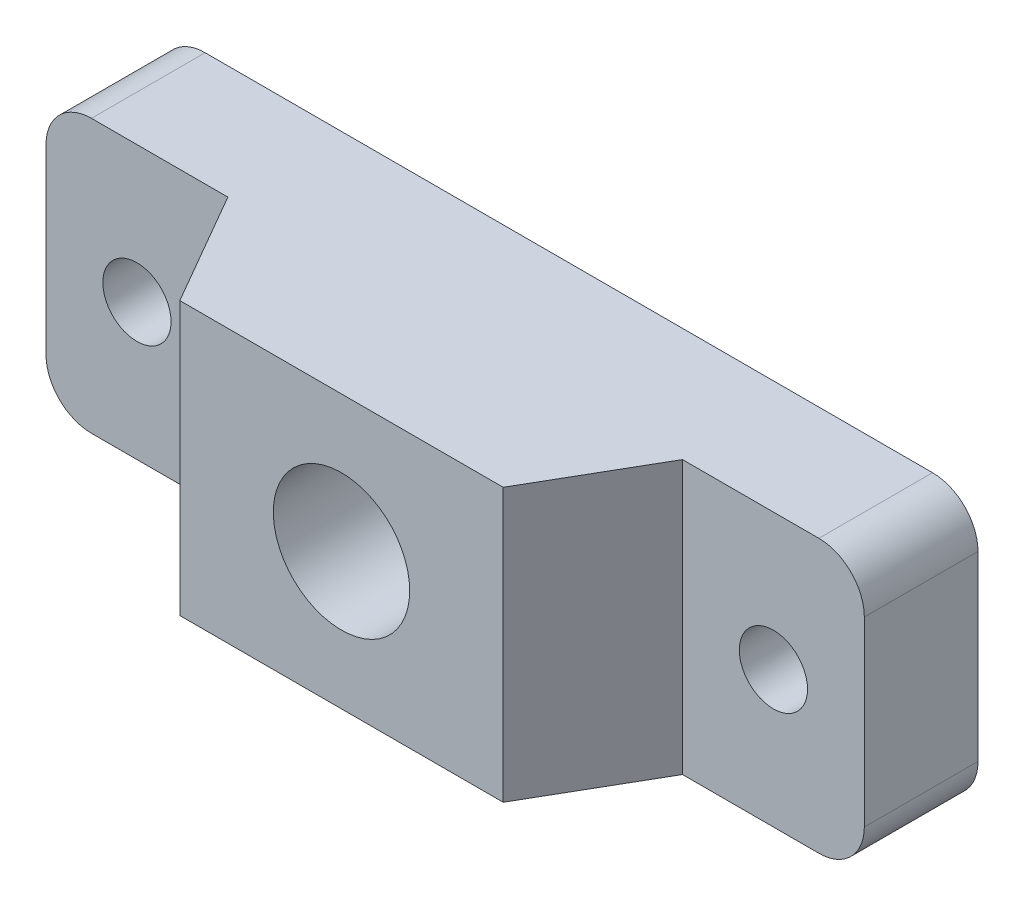
ISO-10303-21;
HEADER;
FILE_DESCRIPTION(('STEP AP214'),'2;1');
FILE_NAME('part.step','',(''),(''),'','','');
FILE_SCHEMA(('AUTOMOTIVE_DESIGN { 1 0 10303 214 1 1 1 1 }'));
ENDSEC;
DATA;
#1=APPLICATION_CONTEXT('core data for automotive mechanical design processes');
#2=APPLICATION_PROTOCOL_DEFINITION('international standard','automotive_design',2000,#1);
#3=PRODUCT_CONTEXT('',#1,'mechanical');
#4=PRODUCT('Part','Part','',(#3));
#5=PRODUCT_RELATED_PRODUCT_CATEGORY('part','',(#4));
#6=PRODUCT_DEFINITION_FORMATION('','',#4);
#7=PRODUCT_DEFINITION_CONTEXT('part definition',#1,'design');
#8=PRODUCT_DEFINITION('design','',#6,#7);
#9=PRODUCT_DEFINITION_SHAPE('','',#8);
#10=(LENGTH_UNIT() NAMED_UNIT(*) SI_UNIT(.MILLI.,.METRE.));
#11=(NAMED_UNIT(*) PLANE_ANGLE_UNIT() SI_UNIT($,.RADIAN.));
#12=(NAMED_UNIT(*) SI_UNIT($,.STERADIAN.) SOLID_ANGLE_UNIT());
#13=UNCERTAINTY_MEASURE_WITH_UNIT(LENGTH_MEASURE(1.E-05),#10,'distance_accuracy_value','');
#14=(GEOMETRIC_REPRESENTATION_CONTEXT(3) GLOBAL_UNCERTAINTY_ASSIGNED_CONTEXT((#13)) GLOBAL_UNIT_ASSIGNED_CONTEXT((#10,
#11,#12)) REPRESENTATION_CONTEXT('',''));
#15=CARTESIAN_POINT('',(0.,0.,0.));
#16=DIRECTION('',(0.,0.,1.));
#17=DIRECTION('',(1.,0.,0.));
#18=AXIS2_PLACEMENT_3D('',#15,#16,#17);
#19=CARTESIAN_POINT('',(0.,0.,10.));
#20=DIRECTION('',(0.,0.,-1.));
#21=DIRECTION('',(-1.,0.,0.));
#22=AXIS2_PLACEMENT_3D('',#19,#20,#21);
#23=PLANE('',#22);
#24=CARTESIAN_POINT('',(0.,0.,10.));
#25=DIRECTION('',(0.,0.,1.));
#26=DIRECTION('',(1.,0.,0.));
#27=AXIS2_PLACEMENT_3D('',#24,#25,#26);
#28=CIRCLE('',#27,3.);
#29=CARTESIAN_POINT('',(3.,0.,10.));
#30=VERTEX_POINT('',#29);
#31=EDGE_CURVE('E185',#30,#30,#28,.T.);
#32=ORIENTED_EDGE('',*,*,#31,.F.);
#33=EDGE_LOOP('',(#32));
#34=FACE_BOUND('',#33,.T.);
#35=DIRECTION('',(0.,-1.,0.));
#36=VECTOR('',#35,1.);
#37=CARTESIAN_POINT('',(-7.11324865405188,6.,10.));
#38=LINE('',#37,#36);
#39=CARTESIAN_POINT('',(-7.11324865405188,6.,10.));
#40=VERTEX_POINT('',#39);
#41=CARTESIAN_POINT('',(-7.11324865405188,-6.,10.));
#42=VERTEX_POINT('',#41);
#43=EDGE_CURVE('E172',#40,#42,#38,.T.);
#44=ORIENTED_EDGE('',*,*,#43,.T.);
#45=DIRECTION('',(1.,0.,0.));
#46=VECTOR('',#45,1.);
#47=CARTESIAN_POINT('',(18.,-6.,10.));
#48=LINE('',#47,#46);
#49=CARTESIAN_POINT('',(7.11324865405189,-6.,10.));
#50=VERTEX_POINT('',#49);
#51=EDGE_CURVE('E191',#42,#50,#48,.T.);
#52=ORIENTED_EDGE('',*,*,#51,.T.);
#53=DIRECTION('',(0.,-1.,0.));
#54=VECTOR('',#53,1.);
#55=CARTESIAN_POINT('',(7.11324865405189,6.00000000000001,10.));
#56=LINE('',#55,#54);
#57=CARTESIAN_POINT('',(7.11324865405189,6.00000000000001,10.));
#58=VERTEX_POINT('',#57);
#59=EDGE_CURVE('E141',#58,#50,#56,.T.);
#60=ORIENTED_EDGE('',*,*,#59,.F.);
#61=DIRECTION('',(-1.,0.,0.));
#62=VECTOR('',#61,1.);
#63=CARTESIAN_POINT('',(18.,6.,10.));
#64=LINE('',#63,#62);
#65=EDGE_CURVE('E149',#58,#40,#64,.T.);
#66=ORIENTED_EDGE('',*,*,#65,.T.);
#67=EDGE_LOOP('',(#44,#52,#60,#66));
#68=FACE_BOUND('',#67,.T.);
#69=ADVANCED_FACE('F34',(#34,#68),#23,.F.);
#70=CARTESIAN_POINT('',(-18.,6.,10.));
#71=DIRECTION('',(1.,0.,0.));
#72=DIRECTION('',(0.,0.,-1.));
#73=AXIS2_PLACEMENT_3D('',#70,#71,#72);
#74=PLANE('',#73);
#75=DIRECTION('',(0.,-1.,0.));
#76=VECTOR('',#75,1.);
#77=CARTESIAN_POINT('',(-18.,6.,0.));
#78=LINE('',#77,#76);
#79=CARTESIAN_POINT('',(-18.,4.,0.));
#80=VERTEX_POINT('',#79);
#81=CARTESIAN_POINT('',(-18.,-4.,0.));
#82=VERTEX_POINT('',#81);
#83=EDGE_CURVE('E188',#80,#82,#78,.T.);
#84=ORIENTED_EDGE('',*,*,#83,.T.);
#85=DIRECTION('',(0.,0.,-1.));
#86=VECTOR('',#85,1.);
#87=CARTESIAN_POINT('',(-18.,-4.,10.));
#88=LINE('',#87,#86);
#89=CARTESIAN_POINT('',(-18.,-4.,5.));
#90=VERTEX_POINT('',#89);
#91=EDGE_CURVE('E224',#82,#90,#88,.F.);
#92=ORIENTED_EDGE('',*,*,#91,.T.);
#93=DIRECTION('',(0.,-1.,0.));
#94=VECTOR('',#93,1.);
#95=CARTESIAN_POINT('',(-18.,6.,5.));
#96=LINE('',#95,#94);
#97=CARTESIAN_POINT('',(-18.,4.,5.));
#98=VERTEX_POINT('',#97);
#99=EDGE_CURVE('E166',#98,#90,#96,.T.);
#100=ORIENTED_EDGE('',*,*,#99,.F.);
#101=DIRECTION('',(0.,0.,-1.));
#102=VECTOR('',#101,1.);
#103=CARTESIAN_POINT('',(-18.,4.,10.));
#104=LINE('',#103,#102);
#105=EDGE_CURVE('E221',#98,#80,#104,.T.);
#106=ORIENTED_EDGE('',*,*,#105,.T.);
#107=EDGE_LOOP('',(#84,#92,#100,#106));
#108=FACE_BOUND('',#107,.T.);
#109=ADVANCED_FACE('F260',(#108),#74,.F.);
#110=CARTESIAN_POINT('',(18.,-6.,10.));
#111=DIRECTION('',(0.,1.,0.));
#112=DIRECTION('',(-1.,0.,0.));
#113=AXIS2_PLACEMENT_3D('',#110,#111,#112);
#114=PLANE('',#113);
#115=DIRECTION('',(-1.,0.,0.));
#116=VECTOR('',#115,1.);
#117=CARTESIAN_POINT('',(-18.,-6.,5.));
#118=LINE('',#117,#116);
#119=CARTESIAN_POINT('',(-9.99999999999999,-6.,5.));
#120=VERTEX_POINT('',#119);
#121=CARTESIAN_POINT('',(-16.,-6.,5.));
#122=VERTEX_POINT('',#121);
#123=EDGE_CURVE('E134',#120,#122,#118,.T.);
#124=ORIENTED_EDGE('',*,*,#123,.T.);
#125=DIRECTION('',(0.,0.,-1.));
#126=VECTOR('',#125,1.);
#127=CARTESIAN_POINT('',(-16.,-6.,10.));
#128=LINE('',#127,#126);
#129=CARTESIAN_POINT('',(-16.,-6.,0.));
#130=VERTEX_POINT('',#129);
#131=EDGE_CURVE('E210',#122,#130,#128,.T.);
#132=ORIENTED_EDGE('',*,*,#131,.T.);
#133=DIRECTION('',(1.,0.,0.));
#134=VECTOR('',#133,1.);
#135=CARTESIAN_POINT('',(18.,-6.,0.));
#136=LINE('',#135,#134);
#137=CARTESIAN_POINT('',(16.,-6.,0.));
#138=VERTEX_POINT('',#137);
#139=EDGE_CURVE('E199',#130,#138,#136,.T.);
#140=ORIENTED_EDGE('',*,*,#139,.T.);
#141=DIRECTION('',(0.,0.,-1.));
#142=VECTOR('',#141,1.);
#143=CARTESIAN_POINT('',(16.,-6.,10.));
#144=LINE('',#143,#142);
#145=CARTESIAN_POINT('',(16.,-6.,5.));
#146=VERTEX_POINT('',#145);
#147=EDGE_CURVE('E196',#138,#146,#144,.F.);
#148=ORIENTED_EDGE('',*,*,#147,.T.);
#149=DIRECTION('',(-1.,0.,0.));
#150=VECTOR('',#149,1.);
#151=CARTESIAN_POINT('',(10.,-6.,5.));
#152=LINE('',#151,#150);
#153=CARTESIAN_POINT('',(10.,-6.,5.));
#154=VERTEX_POINT('',#153);
#155=EDGE_CURVE('E158',#146,#154,#152,.T.);
#156=ORIENTED_EDGE('',*,*,#155,.T.);
#157=DIRECTION('',(-0.499999999999998,0.,0.86602540378444));
#158=VECTOR('',#157,1.);
#159=CARTESIAN_POINT('',(7.11324865405189,-6.,10.));
#160=LINE('',#159,#158);
#161=EDGE_CURVE('E140',#154,#50,#160,.T.);
#162=ORIENTED_EDGE('',*,*,#161,.T.);
#163=ORIENTED_EDGE('',*,*,#51,.F.);
#164=DIRECTION('',(-0.499999999999998,0.,-0.86602540378444));
#165=VECTOR('',#164,1.);
#166=CARTESIAN_POINT('',(-9.99999999999999,-6.,5.));
#167=LINE('',#166,#165);
#168=EDGE_CURVE('E161',#42,#120,#167,.T.);
#169=ORIENTED_EDGE('',*,*,#168,.T.);
#170=EDGE_LOOP('',(#124,#132,#140,#148,#156,#162,#163,#169));
#171=FACE_BOUND('',#170,.T.);
#172=ADVANCED_FACE('F268',(#171),#114,.F.);
#173=CARTESIAN_POINT('',(18.,6.,10.));
#174=DIRECTION('',(-1.,0.,0.));
#175=DIRECTION('',(0.,0.,1.));
#176=AXIS2_PLACEMENT_3D('',#173,#174,#175);
#177=PLANE('',#176);
#178=DIRECTION('',(0.,1.,0.));
#179=VECTOR('',#178,1.);
#180=CARTESIAN_POINT('',(18.,6.,0.));
#181=LINE('',#180,#179);
#182=CARTESIAN_POINT('',(18.,-4.,0.));
#183=VERTEX_POINT('',#182);
#184=CARTESIAN_POINT('',(18.,4.,0.));
#185=VERTEX_POINT('',#184);
#186=EDGE_CURVE('E202',#183,#185,#181,.T.);
#187=ORIENTED_EDGE('',*,*,#186,.T.);
#188=DIRECTION('',(0.,0.,-1.));
#189=VECTOR('',#188,1.);
#190=CARTESIAN_POINT('',(18.,4.,10.));
#191=LINE('',#190,#189);
#192=CARTESIAN_POINT('',(18.,4.,5.));
#193=VERTEX_POINT('',#192);
#194=EDGE_CURVE('E55',#185,#193,#191,.F.);
#195=ORIENTED_EDGE('',*,*,#194,.T.);
#196=DIRECTION('',(0.,-1.,0.));
#197=VECTOR('',#196,1.);
#198=CARTESIAN_POINT('',(18.,6.00000000000001,5.));
#199=LINE('',#198,#197);
#200=CARTESIAN_POINT('',(18.,-4.,5.));
#201=VERTEX_POINT('',#200);
#202=EDGE_CURVE('E142',#193,#201,#199,.T.);
#203=ORIENTED_EDGE('',*,*,#202,.T.);
#204=DIRECTION('',(0.,0.,-1.));
#205=VECTOR('',#204,1.);
#206=CARTESIAN_POINT('',(18.,-4.,10.));
#207=LINE('',#206,#205);
#208=EDGE_CURVE('E234',#201,#183,#207,.T.);
#209=ORIENTED_EDGE('',*,*,#208,.T.);
#210=EDGE_LOOP('',(#187,#195,#203,#209));
#211=FACE_BOUND('',#210,.T.);
#212=ADVANCED_FACE('F239',(#211),#177,.F.);
#213=CARTESIAN_POINT('',(18.,6.,10.));
#214=DIRECTION('',(0.,-1.,0.));
#215=DIRECTION('',(1.,0.,0.));
#216=AXIS2_PLACEMENT_3D('',#213,#214,#215);
#217=PLANE('',#216);
#218=DIRECTION('',(-1.,0.,0.));
#219=VECTOR('',#218,1.);
#220=CARTESIAN_POINT('',(18.,6.,0.));
#221=LINE('',#220,#219);
#222=CARTESIAN_POINT('',(16.,6.,0.));
#223=VERTEX_POINT('',#222);
#224=CARTESIAN_POINT('',(-16.,6.,0.));
#225=VERTEX_POINT('',#224);
#226=EDGE_CURVE('E194',#223,#225,#221,.T.);
#227=ORIENTED_EDGE('',*,*,#226,.T.);
#228=DIRECTION('',(0.,0.,-1.));
#229=VECTOR('',#228,1.);
#230=CARTESIAN_POINT('',(-16.,6.,10.));
#231=LINE('',#230,#229);
#232=CARTESIAN_POINT('',(-16.,6.,5.));
#233=VERTEX_POINT('',#232);
#234=EDGE_CURVE('E232',#225,#233,#231,.F.);
#235=ORIENTED_EDGE('',*,*,#234,.T.);
#236=DIRECTION('',(-1.,0.,0.));
#237=VECTOR('',#236,1.);
#238=CARTESIAN_POINT('',(-18.,6.,5.));
#239=LINE('',#238,#237);
#240=CARTESIAN_POINT('',(-9.99999999999999,6.,5.));
#241=VERTEX_POINT('',#240);
#242=EDGE_CURVE('E153',#241,#233,#239,.T.);
#243=ORIENTED_EDGE('',*,*,#242,.F.);
#244=DIRECTION('',(-0.499999999999998,0.,-0.86602540378444));
#245=VECTOR('',#244,1.);
#246=CARTESIAN_POINT('',(-9.99999999999999,6.,5.));
#247=LINE('',#246,#245);
#248=EDGE_CURVE('E150',#40,#241,#247,.T.);
#249=ORIENTED_EDGE('',*,*,#248,.F.);
#250=ORIENTED_EDGE('',*,*,#65,.F.);
#251=DIRECTION('',(-0.499999999999998,0.,0.86602540378444));
#252=VECTOR('',#251,1.);
#253=CARTESIAN_POINT('',(7.11324865405189,6.00000000000001,10.));
#254=LINE('',#253,#252);
#255=CARTESIAN_POINT('',(10.,6.00000000000001,5.));
#256=VERTEX_POINT('',#255);
#257=EDGE_CURVE('E133',#256,#58,#254,.T.);
#258=ORIENTED_EDGE('',*,*,#257,.F.);
#259=DIRECTION('',(-1.,0.,0.));
#260=VECTOR('',#259,1.);
#261=CARTESIAN_POINT('',(10.,6.00000000000001,5.));
#262=LINE('',#261,#260);
#263=CARTESIAN_POINT('',(16.,6.00000000000001,5.));
#264=VERTEX_POINT('',#263);
#265=EDGE_CURVE('E122',#264,#256,#262,.T.);
#266=ORIENTED_EDGE('',*,*,#265,.F.);
#267=DIRECTION('',(0.,0.,-1.));
#268=VECTOR('',#267,1.);
#269=CARTESIAN_POINT('',(16.,6.,10.));
#270=LINE('',#269,#268);
#271=EDGE_CURVE('E230',#264,#223,#270,.T.);
#272=ORIENTED_EDGE('',*,*,#271,.T.);
#273=EDGE_LOOP('',(#227,#235,#243,#249,#250,#258,#266,#272));
#274=FACE_BOUND('',#273,.T.);
#275=ADVANCED_FACE('F146',(#274),#217,.F.);
#276=CARTESIAN_POINT('',(-14.,0.,0.));
#277=DIRECTION('',(0.,0.,1.));
#278=DIRECTION('',(1.,0.,0.));
#279=AXIS2_PLACEMENT_3D('',#276,#277,#278);
#280=CYLINDRICAL_SURFACE('',#279,1.5);
#281=CARTESIAN_POINT('',(-14.,0.,0.));
#282=DIRECTION('',(0.,0.,1.));
#283=DIRECTION('',(1.,0.,0.));
#284=AXIS2_PLACEMENT_3D('',#281,#282,#283);
#285=CIRCLE('',#284,1.5);
#286=CARTESIAN_POINT('',(-12.5,0.,0.));
#287=VERTEX_POINT('',#286);
#288=EDGE_CURVE('E180',#287,#287,#285,.T.);
#289=ORIENTED_EDGE('',*,*,#288,.F.);
#290=EDGE_LOOP('',(#289));
#291=FACE_BOUND('',#290,.T.);
#292=CARTESIAN_POINT('',(-14.,0.,5.));
#293=DIRECTION('',(0.,0.,1.));
#294=DIRECTION('',(1.,0.,0.));
#295=AXIS2_PLACEMENT_3D('',#292,#293,#294);
#296=CIRCLE('',#295,1.5);
#297=CARTESIAN_POINT('',(-12.5,0.,5.));
#298=VERTEX_POINT('',#297);
#299=EDGE_CURVE('E181',#298,#298,#296,.F.);
#300=ORIENTED_EDGE('',*,*,#299,.F.);
#301=EDGE_LOOP('',(#300));
#302=FACE_BOUND('',#301,.T.);
#303=ADVANCED_FACE('F296',(#291,#302),#280,.F.);
#304=CARTESIAN_POINT('',(14.,0.,0.));
#305=DIRECTION('',(0.,0.,1.));
#306=DIRECTION('',(1.,0.,0.));
#307=AXIS2_PLACEMENT_3D('',#304,#305,#306);
#308=CYLINDRICAL_SURFACE('',#307,1.5);
#309=CARTESIAN_POINT('',(14.,0.,0.));
#310=DIRECTION('',(0.,0.,1.));
#311=DIRECTION('',(1.,0.,0.));
#312=AXIS2_PLACEMENT_3D('',#309,#310,#311);
#313=CIRCLE('',#312,1.5);
#314=CARTESIAN_POINT('',(15.5,0.,0.));
#315=VERTEX_POINT('',#314);
#316=EDGE_CURVE('E177',#315,#315,#313,.T.);
#317=ORIENTED_EDGE('',*,*,#316,.F.);
#318=EDGE_LOOP('',(#317));
#319=FACE_BOUND('',#318,.T.);
#320=CARTESIAN_POINT('',(14.,0.,5.));
#321=DIRECTION('',(0.,0.,1.));
#322=DIRECTION('',(1.,0.,0.));
#323=AXIS2_PLACEMENT_3D('',#320,#321,#322);
#324=CIRCLE('',#323,1.5);
#325=CARTESIAN_POINT('',(15.5,0.,5.));
#326=VERTEX_POINT('',#325);
#327=EDGE_CURVE('E169',#326,#326,#324,.F.);
#328=ORIENTED_EDGE('',*,*,#327,.F.);
#329=EDGE_LOOP('',(#328));
#330=FACE_BOUND('',#329,.T.);
#331=ADVANCED_FACE('F292',(#319,#330),#308,.F.);
#332=CARTESIAN_POINT('',(0.,0.,0.));
#333=DIRECTION('',(0.,0.,-1.));
#334=DIRECTION('',(-1.,0.,0.));
#335=AXIS2_PLACEMENT_3D('',#332,#333,#334);
#336=PLANE('',#335);
#337=ORIENTED_EDGE('',*,*,#316,.T.);
#338=EDGE_LOOP('',(#337));
#339=FACE_BOUND('',#338,.T.);
#340=ORIENTED_EDGE('',*,*,#288,.T.);
#341=EDGE_LOOP('',(#340));
#342=FACE_BOUND('',#341,.T.);
#343=ORIENTED_EDGE('',*,*,#139,.F.);
#344=CARTESIAN_POINT('',(-16.,-4.,0.));
#345=DIRECTION('',(0.,0.,-1.));
#346=DIRECTION('',(-1.,0.,0.));
#347=AXIS2_PLACEMENT_3D('',#344,#345,#346);
#348=CIRCLE('',#347,2.);
#349=EDGE_CURVE('E219',#130,#82,#348,.T.);
#350=ORIENTED_EDGE('',*,*,#349,.T.);
#351=ORIENTED_EDGE('',*,*,#83,.F.);
#352=CARTESIAN_POINT('',(-16.,4.,0.));
#353=DIRECTION('',(0.,0.,-1.));
#354=DIRECTION('',(-1.,0.,0.));
#355=AXIS2_PLACEMENT_3D('',#352,#353,#354);
#356=CIRCLE('',#355,2.);
#357=EDGE_CURVE('E217',#80,#225,#356,.T.);
#358=ORIENTED_EDGE('',*,*,#357,.T.);
#359=ORIENTED_EDGE('',*,*,#226,.F.);
#360=CARTESIAN_POINT('',(16.,4.,0.));
#361=DIRECTION('',(0.,0.,-1.));
#362=DIRECTION('',(-1.,0.,0.));
#363=AXIS2_PLACEMENT_3D('',#360,#361,#362);
#364=CIRCLE('',#363,2.);
#365=EDGE_CURVE('E215',#223,#185,#364,.T.);
#366=ORIENTED_EDGE('',*,*,#365,.T.);
#367=ORIENTED_EDGE('',*,*,#186,.F.);
#368=CARTESIAN_POINT('',(16.,-4.,0.));
#369=DIRECTION('',(0.,0.,-1.));
#370=DIRECTION('',(-1.,0.,0.));
#371=AXIS2_PLACEMENT_3D('',#368,#369,#370);
#372=CIRCLE('',#371,2.);
#373=EDGE_CURVE('E213',#183,#138,#372,.T.);
#374=ORIENTED_EDGE('',*,*,#373,.T.);
#375=EDGE_LOOP('',(#343,#350,#351,#358,#359,#366,#367,#374));
#376=FACE_BOUND('',#375,.T.);
#377=CARTESIAN_POINT('',(0.,0.,0.));
#378=DIRECTION('',(0.,0.,1.));
#379=DIRECTION('',(1.,0.,0.));
#380=AXIS2_PLACEMENT_3D('',#377,#378,#379);
#381=CIRCLE('',#380,3.);
#382=CARTESIAN_POINT('',(3.,0.,0.));
#383=VERTEX_POINT('',#382);
#384=EDGE_CURVE('E184',#383,#383,#381,.T.);
#385=ORIENTED_EDGE('',*,*,#384,.T.);
#386=EDGE_LOOP('',(#385));
#387=FACE_BOUND('',#386,.T.);
#388=ADVANCED_FACE('F243',(#339,#342,#376,#387),#336,.T.);
#389=CARTESIAN_POINT('',(0.,0.,10.));
#390=DIRECTION('',(0.,0.,-1.));
#391=DIRECTION('',(-1.,0.,0.));
#392=AXIS2_PLACEMENT_3D('',#389,#390,#391);
#393=CYLINDRICAL_SURFACE('',#392,3.);
#394=ORIENTED_EDGE('',*,*,#31,.T.);
#395=EDGE_LOOP('',(#394));
#396=FACE_BOUND('',#395,.T.);
#397=ORIENTED_EDGE('',*,*,#384,.F.);
#398=EDGE_LOOP('',(#397));
#399=FACE_BOUND('',#398,.T.);
#400=ADVANCED_FACE('F288',(#396,#399),#393,.F.);
#401=CARTESIAN_POINT('',(10.,6.00000000000001,5.));
#402=DIRECTION('',(0.,0.,1.));
#403=DIRECTION('',(1.,0.,0.));
#404=AXIS2_PLACEMENT_3D('',#401,#402,#403);
#405=PLANE('',#404);
#406=ORIENTED_EDGE('',*,*,#202,.F.);
#407=CARTESIAN_POINT('',(16.,4.,5.));
#408=DIRECTION('',(0.,0.,1.));
#409=DIRECTION('',(1.,0.,0.));
#410=AXIS2_PLACEMENT_3D('',#407,#408,#409);
#411=CIRCLE('',#410,2.);
#412=EDGE_CURVE('E12',#193,#264,#411,.T.);
#413=ORIENTED_EDGE('',*,*,#412,.T.);
#414=ORIENTED_EDGE('',*,*,#265,.T.);
#415=DIRECTION('',(0.,-1.,0.));
#416=VECTOR('',#415,1.);
#417=CARTESIAN_POINT('',(10.,6.00000000000001,5.));
#418=LINE('',#417,#416);
#419=EDGE_CURVE('E126',#256,#154,#418,.T.);
#420=ORIENTED_EDGE('',*,*,#419,.T.);
#421=ORIENTED_EDGE('',*,*,#155,.F.);
#422=CARTESIAN_POINT('',(16.,-4.,5.));
#423=DIRECTION('',(0.,0.,1.));
#424=DIRECTION('',(1.,0.,0.));
#425=AXIS2_PLACEMENT_3D('',#422,#423,#424);
#426=CIRCLE('',#425,2.);
#427=EDGE_CURVE('E42',#146,#201,#426,.T.);
#428=ORIENTED_EDGE('',*,*,#427,.T.);
#429=EDGE_LOOP('',(#406,#413,#414,#420,#421,#428));
#430=FACE_BOUND('',#429,.T.);
#431=ORIENTED_EDGE('',*,*,#327,.T.);
#432=EDGE_LOOP('',(#431));
#433=FACE_BOUND('',#432,.T.);
#434=ADVANCED_FACE('F124',(#430,#433),#405,.T.);
#435=CARTESIAN_POINT('',(7.11324865405189,6.00000000000001,10.));
#436=DIRECTION('',(0.86602540378444,0.,0.499999999999998));
#437=DIRECTION('',(0.499999999999998,0.,-0.86602540378444));
#438=AXIS2_PLACEMENT_3D('',#435,#436,#437);
#439=PLANE('',#438);
#440=ORIENTED_EDGE('',*,*,#161,.F.);
#441=ORIENTED_EDGE('',*,*,#419,.F.);
#442=ORIENTED_EDGE('',*,*,#257,.T.);
#443=ORIENTED_EDGE('',*,*,#59,.T.);
#444=EDGE_LOOP('',(#440,#441,#442,#443));
#445=FACE_BOUND('',#444,.T.);
#446=ADVANCED_FACE('F137',(#445),#439,.T.);
#447=CARTESIAN_POINT('',(-18.,6.,5.));
#448=DIRECTION('',(0.,0.,1.));
#449=DIRECTION('',(1.,0.,0.));
#450=AXIS2_PLACEMENT_3D('',#447,#448,#449);
#451=PLANE('',#450);
#452=ORIENTED_EDGE('',*,*,#99,.T.);
#453=CARTESIAN_POINT('',(-16.,-4.,5.));
#454=DIRECTION('',(0.,0.,1.));
#455=DIRECTION('',(1.,0.,0.));
#456=AXIS2_PLACEMENT_3D('',#453,#454,#455);
#457=CIRCLE('',#456,2.);
#458=EDGE_CURVE('E228',#90,#122,#457,.T.);
#459=ORIENTED_EDGE('',*,*,#458,.T.);
#460=ORIENTED_EDGE('',*,*,#123,.F.);
#461=DIRECTION('',(0.,-1.,0.));
#462=VECTOR('',#461,1.);
#463=CARTESIAN_POINT('',(-9.99999999999999,6.,5.));
#464=LINE('',#463,#462);
#465=EDGE_CURVE('E170',#241,#120,#464,.T.);
#466=ORIENTED_EDGE('',*,*,#465,.F.);
#467=ORIENTED_EDGE('',*,*,#242,.T.);
#468=CARTESIAN_POINT('',(-16.,4.,5.));
#469=DIRECTION('',(0.,0.,1.));
#470=DIRECTION('',(1.,0.,0.));
#471=AXIS2_PLACEMENT_3D('',#468,#469,#470);
#472=CIRCLE('',#471,2.);
#473=EDGE_CURVE('E226',#233,#98,#472,.T.);
#474=ORIENTED_EDGE('',*,*,#473,.T.);
#475=EDGE_LOOP('',(#452,#459,#460,#466,#467,#474));
#476=FACE_BOUND('',#475,.T.);
#477=ORIENTED_EDGE('',*,*,#299,.T.);
#478=EDGE_LOOP('',(#477));
#479=FACE_BOUND('',#478,.T.);
#480=ADVANCED_FACE('F256',(#476,#479),#451,.T.);
#481=CARTESIAN_POINT('',(-9.99999999999999,6.,5.));
#482=DIRECTION('',(-0.86602540378444,0.,0.499999999999998));
#483=DIRECTION('',(0.499999999999998,0.,0.86602540378444));
#484=AXIS2_PLACEMENT_3D('',#481,#482,#483);
#485=PLANE('',#484);
#486=ORIENTED_EDGE('',*,*,#168,.F.);
#487=ORIENTED_EDGE('',*,*,#43,.F.);
#488=ORIENTED_EDGE('',*,*,#248,.T.);
#489=ORIENTED_EDGE('',*,*,#465,.T.);
#490=EDGE_LOOP('',(#486,#487,#488,#489));
#491=FACE_BOUND('',#490,.T.);
#492=ADVANCED_FACE('F271',(#491),#485,.T.);
#493=CARTESIAN_POINT('',(-16.,-4.,10.));
#494=DIRECTION('',(0.,0.,-1.));
#495=DIRECTION('',(-1.,0.,0.));
#496=AXIS2_PLACEMENT_3D('',#493,#494,#495);
#497=CYLINDRICAL_SURFACE('',#496,2.);
#498=ORIENTED_EDGE('',*,*,#458,.F.);
#499=ORIENTED_EDGE('',*,*,#91,.F.);
#500=ORIENTED_EDGE('',*,*,#349,.F.);
#501=ORIENTED_EDGE('',*,*,#131,.F.);
#502=EDGE_LOOP('',(#498,#499,#500,#501));
#503=FACE_BOUND('',#502,.T.);
#504=ADVANCED_FACE('F264',(#503),#497,.T.);
#505=CARTESIAN_POINT('',(-16.,4.,10.));
#506=DIRECTION('',(0.,0.,-1.));
#507=DIRECTION('',(-1.,0.,0.));
#508=AXIS2_PLACEMENT_3D('',#505,#506,#507);
#509=CYLINDRICAL_SURFACE('',#508,2.);
#510=ORIENTED_EDGE('',*,*,#473,.F.);
#511=ORIENTED_EDGE('',*,*,#234,.F.);
#512=ORIENTED_EDGE('',*,*,#357,.F.);
#513=ORIENTED_EDGE('',*,*,#105,.F.);
#514=EDGE_LOOP('',(#510,#511,#512,#513));
#515=FACE_BOUND('',#514,.T.);
#516=ADVANCED_FACE('F252',(#515),#509,.T.);
#517=CARTESIAN_POINT('',(16.,4.,10.));
#518=DIRECTION('',(0.,0.,-1.));
#519=DIRECTION('',(-1.,0.,0.));
#520=AXIS2_PLACEMENT_3D('',#517,#518,#519);
#521=CYLINDRICAL_SURFACE('',#520,2.);
#522=ORIENTED_EDGE('',*,*,#412,.F.);
#523=ORIENTED_EDGE('',*,*,#194,.F.);
#524=ORIENTED_EDGE('',*,*,#365,.F.);
#525=ORIENTED_EDGE('',*,*,#271,.F.);
#526=EDGE_LOOP('',(#522,#523,#524,#525));
#527=FACE_BOUND('',#526,.T.);
#528=ADVANCED_FACE('F247',(#527),#521,.T.);
#529=CARTESIAN_POINT('',(16.,-4.,10.));
#530=DIRECTION('',(0.,0.,-1.));
#531=DIRECTION('',(-1.,0.,0.));
#532=AXIS2_PLACEMENT_3D('',#529,#530,#531);
#533=CYLINDRICAL_SURFACE('',#532,2.);
#534=ORIENTED_EDGE('',*,*,#427,.F.);
#535=ORIENTED_EDGE('',*,*,#147,.F.);
#536=ORIENTED_EDGE('',*,*,#373,.F.);
#537=ORIENTED_EDGE('',*,*,#208,.F.);
#538=EDGE_LOOP('',(#534,#535,#536,#537));
#539=FACE_BOUND('',#538,.T.);
#540=ADVANCED_FACE('F36',(#539),#533,.T.);
#541=CLOSED_SHELL('',(#69,#109,#172,#212,#275,#303,#331,#388,#400,#434,#446,#480,#492,#504,#516,
#528,#540));
#542=MANIFOLD_SOLID_BREP('B2',#541);
#543=ADVANCED_BREP_SHAPE_REPRESENTATION('',(#18,#542),#14);
#544=SHAPE_DEFINITION_REPRESENTATION(#9,#543);
ENDSEC;
END-ISO-10303-21;
